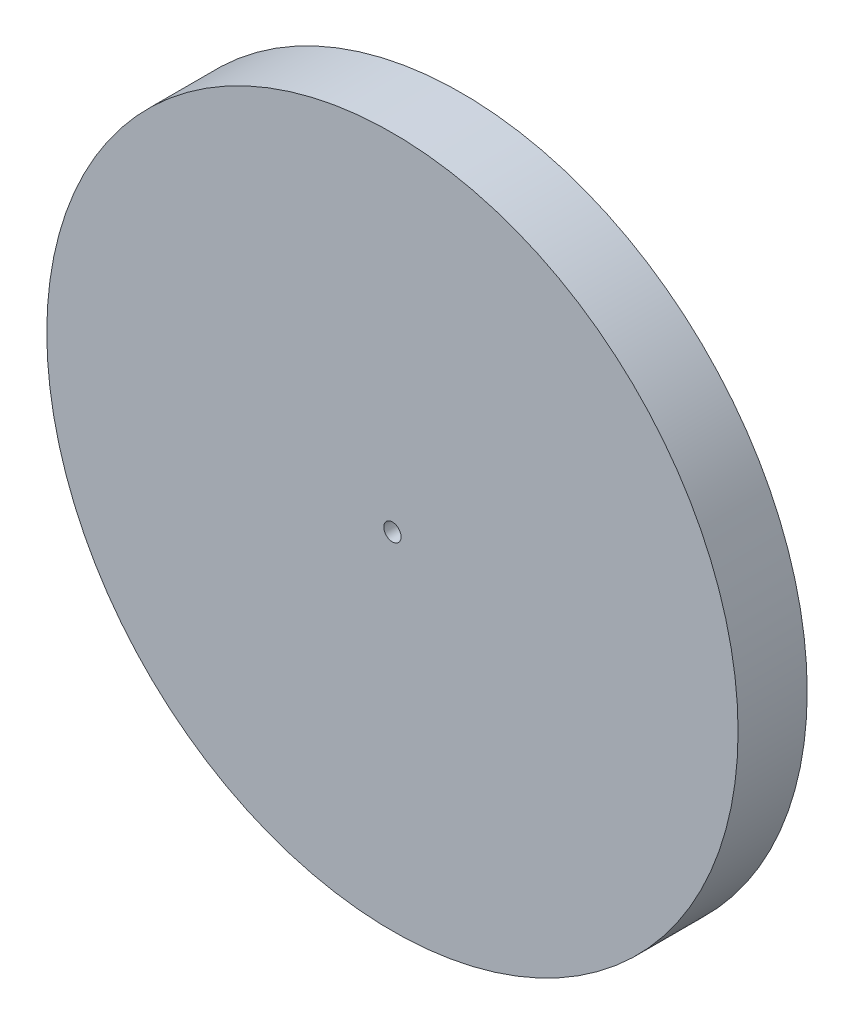
ISO-10303-21;
HEADER;
FILE_DESCRIPTION(('STEP AP214'),'2;1');
FILE_NAME('part.step','',(''),(''),'','','');
FILE_SCHEMA(('AUTOMOTIVE_DESIGN { 1 0 10303 214 1 1 1 1 }'));
ENDSEC;
DATA;
#1=APPLICATION_CONTEXT('core data for automotive mechanical design processes');
#2=APPLICATION_PROTOCOL_DEFINITION('international standard','automotive_design',2000,#1);
#3=PRODUCT_CONTEXT('',#1,'mechanical');
#4=PRODUCT('Part','Part','',(#3));
#5=PRODUCT_RELATED_PRODUCT_CATEGORY('part','',(#4));
#6=PRODUCT_DEFINITION_FORMATION('','',#4);
#7=PRODUCT_DEFINITION_CONTEXT('part definition',#1,'design');
#8=PRODUCT_DEFINITION('design','',#6,#7);
#9=PRODUCT_DEFINITION_SHAPE('','',#8);
#10=(LENGTH_UNIT() NAMED_UNIT(*) SI_UNIT(.MILLI.,.METRE.));
#11=(NAMED_UNIT(*) PLANE_ANGLE_UNIT() SI_UNIT($,.RADIAN.));
#12=(NAMED_UNIT(*) SI_UNIT($,.STERADIAN.) SOLID_ANGLE_UNIT());
#13=UNCERTAINTY_MEASURE_WITH_UNIT(LENGTH_MEASURE(1.E-05),#10,'distance_accuracy_value','');
#14=(GEOMETRIC_REPRESENTATION_CONTEXT(3) GLOBAL_UNCERTAINTY_ASSIGNED_CONTEXT((#13)) GLOBAL_UNIT_ASSIGNED_CONTEXT((#10,
#11,#12)) REPRESENTATION_CONTEXT('',''));
#15=CARTESIAN_POINT('',(0.,0.,0.));
#16=DIRECTION('',(0.,0.,1.));
#17=DIRECTION('',(1.,0.,0.));
#18=AXIS2_PLACEMENT_3D('',#15,#16,#17);
#19=CARTESIAN_POINT('',(-20.5220573799337,15.0559019095775,25.4));
#20=DIRECTION('',(0.,0.,-1.));
#21=DIRECTION('',(-1.,0.,0.));
#22=AXIS2_PLACEMENT_3D('',#19,#20,#21);
#23=CYLINDRICAL_SURFACE('',#22,3.175);
#24=CARTESIAN_POINT('',(-20.5220573799337,15.0559019095775,25.4));
#25=DIRECTION('',(0.,0.,1.));
#26=DIRECTION('',(1.,0.,0.));
#27=AXIS2_PLACEMENT_3D('',#24,#25,#26);
#28=CIRCLE('',#27,3.175);
#29=CARTESIAN_POINT('',(-17.3470573799337,15.0559019095775,25.4));
#30=VERTEX_POINT('',#29);
#31=EDGE_CURVE('E51',#30,#30,#28,.T.);
#32=ORIENTED_EDGE('',*,*,#31,.T.);
#33=EDGE_LOOP('',(#32));
#34=FACE_BOUND('',#33,.T.);
#35=CARTESIAN_POINT('',(-20.5220573799337,15.0559019095775,7.62));
#36=DIRECTION('',(0.,0.,-1.));
#37=DIRECTION('',(-1.,0.,0.));
#38=AXIS2_PLACEMENT_3D('',#35,#36,#37);
#39=CIRCLE('',#38,3.175);
#40=CARTESIAN_POINT('',(-23.6970573799337,15.0559019095775,7.62));
#41=VERTEX_POINT('',#40);
#42=EDGE_CURVE('E40',#41,#41,#39,.T.);
#43=ORIENTED_EDGE('',*,*,#42,.T.);
#44=EDGE_LOOP('',(#43));
#45=FACE_BOUND('',#44,.T.);
#46=ADVANCED_FACE('F36',(#34,#45),#23,.F.);
#47=CARTESIAN_POINT('',(-20.5220573799337,15.0559019095775,25.4));
#48=DIRECTION('',(0.,0.,1.));
#49=DIRECTION('',(1.,0.,0.));
#50=AXIS2_PLACEMENT_3D('',#47,#48,#49);
#51=PLANE('',#50);
#52=CARTESIAN_POINT('',(-20.5220573799337,15.0559019095775,25.4));
#53=DIRECTION('',(0.,0.,1.));
#54=DIRECTION('',(1.,0.,0.));
#55=AXIS2_PLACEMENT_3D('',#52,#53,#54);
#56=CIRCLE('',#55,127.);
#57=CARTESIAN_POINT('',(106.477942620066,15.0559019095775,25.4));
#58=VERTEX_POINT('',#57);
#59=EDGE_CURVE('E10',#58,#58,#56,.T.);
#60=ORIENTED_EDGE('',*,*,#59,.T.);
#61=EDGE_LOOP('',(#60));
#62=FACE_BOUND('',#61,.T.);
#63=ORIENTED_EDGE('',*,*,#31,.F.);
#64=EDGE_LOOP('',(#63));
#65=FACE_BOUND('',#64,.T.);
#66=ADVANCED_FACE('F80',(#62,#65),#51,.T.);
#67=CARTESIAN_POINT('',(-20.5220573799337,15.0559019095775,0.));
#68=DIRECTION('',(0.,0.,1.));
#69=DIRECTION('',(1.,0.,0.));
#70=AXIS2_PLACEMENT_3D('',#67,#68,#69);
#71=PLANE('',#70);
#72=CARTESIAN_POINT('',(-20.5220573799337,15.0559019095775,0.));
#73=DIRECTION('',(0.,0.,-1.));
#74=DIRECTION('',(-1.,0.,0.));
#75=AXIS2_PLACEMENT_3D('',#72,#73,#74);
#76=CIRCLE('',#75,6.35);
#77=CARTESIAN_POINT('',(-26.8720573799337,15.0559019095775,0.));
#78=VERTEX_POINT('',#77);
#79=EDGE_CURVE('E56',#78,#78,#76,.T.);
#80=ORIENTED_EDGE('',*,*,#79,.F.);
#81=EDGE_LOOP('',(#80));
#82=FACE_BOUND('',#81,.T.);
#83=CARTESIAN_POINT('',(-20.5220573799337,15.0559019095775,0.));
#84=DIRECTION('',(0.,0.,1.));
#85=DIRECTION('',(1.,0.,0.));
#86=AXIS2_PLACEMENT_3D('',#83,#84,#85);
#87=CIRCLE('',#86,127.);
#88=CARTESIAN_POINT('',(106.477942620066,15.0559019095775,0.));
#89=VERTEX_POINT('',#88);
#90=EDGE_CURVE('E45',#89,#89,#87,.T.);
#91=ORIENTED_EDGE('',*,*,#90,.F.);
#92=EDGE_LOOP('',(#91));
#93=FACE_BOUND('',#92,.T.);
#94=ADVANCED_FACE('F88',(#82,#93),#71,.F.);
#95=CARTESIAN_POINT('',(-20.5220573799337,15.0559019095775,25.4));
#96=DIRECTION('',(0.,0.,-1.));
#97=DIRECTION('',(-1.,0.,0.));
#98=AXIS2_PLACEMENT_3D('',#95,#96,#97);
#99=CYLINDRICAL_SURFACE('',#98,127.);
#100=ORIENTED_EDGE('',*,*,#59,.F.);
#101=EDGE_LOOP('',(#100));
#102=FACE_BOUND('',#101,.T.);
#103=ORIENTED_EDGE('',*,*,#90,.T.);
#104=EDGE_LOOP('',(#103));
#105=FACE_BOUND('',#104,.T.);
#106=ADVANCED_FACE('F38',(#102,#105),#99,.T.);
#107=CARTESIAN_POINT('',(-20.5220573799337,15.0559019095775,7.62));
#108=DIRECTION('',(0.,0.,-1.));
#109=DIRECTION('',(-1.,0.,0.));
#110=AXIS2_PLACEMENT_3D('',#107,#108,#109);
#111=CYLINDRICAL_SURFACE('',#110,6.35);
#112=CARTESIAN_POINT('',(-20.5220573799337,15.0559019095775,7.62));
#113=DIRECTION('',(0.,0.,-1.));
#114=DIRECTION('',(-1.,0.,0.));
#115=AXIS2_PLACEMENT_3D('',#112,#113,#114);
#116=CIRCLE('',#115,6.35);
#117=CARTESIAN_POINT('',(-26.8720573799337,15.0559019095775,7.62));
#118=VERTEX_POINT('',#117);
#119=EDGE_CURVE('E60',#118,#118,#116,.T.);
#120=CARTESIAN_POINT('',(-26.8720573799337,15.0559019095775,7.62));
#121=CARTESIAN_POINT('',(-26.8720573799337,15.0559019095775,7.540625));
#122=CARTESIAN_POINT('',(-26.8720573799337,15.0559019095775,7.46125));
#123=CARTESIAN_POINT('',(-26.8720573799337,15.0559019095775,7.3025));
#124=CARTESIAN_POINT('',(-26.8720573799337,15.0559019095775,7.223125));
#125=CARTESIAN_POINT('',(-26.8720573799337,15.0559019095775,7.064375));
#126=CARTESIAN_POINT('',(-26.8720573799337,15.0559019095775,6.985));
#127=CARTESIAN_POINT('',(-26.8720573799337,15.0559019095775,6.82625));
#128=CARTESIAN_POINT('',(-26.8720573799337,15.0559019095775,6.746875));
#129=CARTESIAN_POINT('',(-26.8720573799337,15.0559019095775,6.588125));
#130=CARTESIAN_POINT('',(-26.8720573799337,15.0559019095775,6.50875));
#131=CARTESIAN_POINT('',(-26.8720573799337,15.0559019095775,6.35));
#132=CARTESIAN_POINT('',(-26.8720573799337,15.0559019095775,6.270625));
#133=CARTESIAN_POINT('',(-26.8720573799337,15.0559019095775,6.111875));
#134=CARTESIAN_POINT('',(-26.8720573799337,15.0559019095775,6.0325));
#135=CARTESIAN_POINT('',(-26.8720573799337,15.0559019095775,5.87375));
#136=CARTESIAN_POINT('',(-26.8720573799337,15.0559019095775,5.794375));
#137=CARTESIAN_POINT('',(-26.8720573799337,15.0559019095775,5.635625));
#138=CARTESIAN_POINT('',(-26.8720573799337,15.0559019095775,5.55625));
#139=CARTESIAN_POINT('',(-26.8720573799337,15.0559019095775,5.3975));
#140=CARTESIAN_POINT('',(-26.8720573799337,15.0559019095775,5.318125));
#141=CARTESIAN_POINT('',(-26.8720573799337,15.0559019095775,5.159375));
#142=CARTESIAN_POINT('',(-26.8720573799337,15.0559019095775,5.08));
#143=CARTESIAN_POINT('',(-26.8720573799337,15.0559019095775,4.92125));
#144=CARTESIAN_POINT('',(-26.8720573799337,15.0559019095775,4.841875));
#145=CARTESIAN_POINT('',(-26.8720573799337,15.0559019095775,4.683125));
#146=CARTESIAN_POINT('',(-26.8720573799337,15.0559019095775,4.60375));
#147=CARTESIAN_POINT('',(-26.8720573799337,15.0559019095775,4.445));
#148=CARTESIAN_POINT('',(-26.8720573799337,15.0559019095775,4.365625));
#149=CARTESIAN_POINT('',(-26.8720573799337,15.0559019095775,4.206875));
#150=CARTESIAN_POINT('',(-26.8720573799337,15.0559019095775,4.1275));
#151=CARTESIAN_POINT('',(-26.8720573799337,15.0559019095775,3.96875));
#152=CARTESIAN_POINT('',(-26.8720573799337,15.0559019095775,3.889375));
#153=CARTESIAN_POINT('',(-26.8720573799337,15.0559019095775,3.730625));
#154=CARTESIAN_POINT('',(-26.8720573799337,15.0559019095775,3.65125));
#155=CARTESIAN_POINT('',(-26.8720573799337,15.0559019095775,3.4925));
#156=CARTESIAN_POINT('',(-26.8720573799337,15.0559019095775,3.413125));
#157=CARTESIAN_POINT('',(-26.8720573799337,15.0559019095775,3.254375));
#158=CARTESIAN_POINT('',(-26.8720573799337,15.0559019095775,3.175));
#159=CARTESIAN_POINT('',(-26.8720573799337,15.0559019095775,3.01625));
#160=CARTESIAN_POINT('',(-26.8720573799337,15.0559019095775,2.936875));
#161=CARTESIAN_POINT('',(-26.8720573799337,15.0559019095775,2.778125));
#162=CARTESIAN_POINT('',(-26.8720573799337,15.0559019095775,2.69875));
#163=CARTESIAN_POINT('',(-26.8720573799337,15.0559019095775,2.54));
#164=CARTESIAN_POINT('',(-26.8720573799337,15.0559019095775,2.460625));
#165=CARTESIAN_POINT('',(-26.8720573799337,15.0559019095775,2.301875));
#166=CARTESIAN_POINT('',(-26.8720573799337,15.0559019095775,2.2225));
#167=CARTESIAN_POINT('',(-26.8720573799337,15.0559019095775,2.06375));
#168=CARTESIAN_POINT('',(-26.8720573799337,15.0559019095775,1.984375));
#169=CARTESIAN_POINT('',(-26.8720573799337,15.0559019095775,1.825625));
#170=CARTESIAN_POINT('',(-26.8720573799337,15.0559019095775,1.74625));
#171=CARTESIAN_POINT('',(-26.8720573799337,15.0559019095775,1.5875));
#172=CARTESIAN_POINT('',(-26.8720573799337,15.0559019095775,1.508125));
#173=CARTESIAN_POINT('',(-26.8720573799337,15.0559019095775,1.349375));
#174=CARTESIAN_POINT('',(-26.8720573799337,15.0559019095775,1.27));
#175=CARTESIAN_POINT('',(-26.8720573799337,15.0559019095775,1.11125));
#176=CARTESIAN_POINT('',(-26.8720573799337,15.0559019095775,1.031875));
#177=CARTESIAN_POINT('',(-26.8720573799337,15.0559019095775,0.873125));
#178=CARTESIAN_POINT('',(-26.8720573799337,15.0559019095775,0.79375));
#179=CARTESIAN_POINT('',(-26.8720573799337,15.0559019095775,0.635));
#180=CARTESIAN_POINT('',(-26.8720573799337,15.0559019095775,0.555625));
#181=CARTESIAN_POINT('',(-26.8720573799337,15.0559019095775,0.396875));
#182=CARTESIAN_POINT('',(-26.8720573799337,15.0559019095775,0.3175));
#183=CARTESIAN_POINT('',(-26.8720573799337,15.0559019095775,0.15875));
#184=CARTESIAN_POINT('',(-26.8720573799337,15.0559019095775,0.0793749999999999));
#185=CARTESIAN_POINT('',(-26.8720573799337,15.0559019095775,0.));
#186=B_SPLINE_CURVE_WITH_KNOTS('',3,(#120,#121,#122,#123,#124,#125,#126,#127,#128,#129,#130,
#131,#132,#133,#134,#135,#136,#137,#138,#139,#140,#141,#142,#143,#144,#145,#146,#147,#148,#149,
#150,#151,#152,#153,#154,#155,#156,#157,#158,#159,#160,#161,#162,#163,#164,#165,#166,#167,#168,
#169,#170,#171,#172,#173,#174,#175,#176,#177,#178,#179,#180,#181,#182,#183,#184,#185),
.UNSPECIFIED.,.F.,.F.,(4,2,2,2,2,2,2,2,2,2,2,2,2,2,2,2,2,2,2,2,2,2,2,2,2,2,2,2,2,2,2,2,4),(0.,
0.238125,0.476249999999999,0.714375,0.952499999999999,1.190625,1.42875,1.666875,1.905,2.143125,
2.38125,2.619375,2.8575,3.095625,3.33375,3.571875,3.81,4.048125,4.28625,4.524375,4.7625,
5.000625,5.23875,5.476875,5.715,5.953125,6.19125,6.429375,6.6675,6.905625,7.14375,7.381875,
7.62),.UNSPECIFIED.);
#187=EDGE_CURVE('BSEAM72',#118,#78,#186,.T.);
#188=ORIENTED_EDGE('',*,*,#119,.F.);
#189=ORIENTED_EDGE('',*,*,#79,.T.);
#190=ORIENTED_EDGE('',*,*,#187,.T.);
#191=ORIENTED_EDGE('',*,*,#187,.F.);
#192=EDGE_LOOP('',(#188,#190,#189,#191));
#193=FACE_BOUND('',#192,.T.);
#194=ADVANCED_FACE('F72',(#193),#111,.F.);
#195=CARTESIAN_POINT('',(-20.5220573799337,15.0559019095775,7.62));
#196=DIRECTION('',(0.,0.,-1.));
#197=DIRECTION('',(-1.,0.,0.));
#198=AXIS2_PLACEMENT_3D('',#195,#196,#197);
#199=PLANE('',#198);
#200=ORIENTED_EDGE('',*,*,#42,.F.);
#201=EDGE_LOOP('',(#200));
#202=FACE_BOUND('',#201,.T.);
#203=ORIENTED_EDGE('',*,*,#119,.T.);
#204=EDGE_LOOP('',(#203));
#205=FACE_BOUND('',#204,.T.);
#206=ADVANCED_FACE('F70',(#202,#205),#199,.T.);
#207=CLOSED_SHELL('',(#46,#66,#94,#106,#194,#206));
#208=MANIFOLD_SOLID_BREP('B2',#207);
#209=ADVANCED_BREP_SHAPE_REPRESENTATION('',(#18,#208),#14);
#210=SHAPE_DEFINITION_REPRESENTATION(#9,#209);
ENDSEC;
END-ISO-10303-21;
